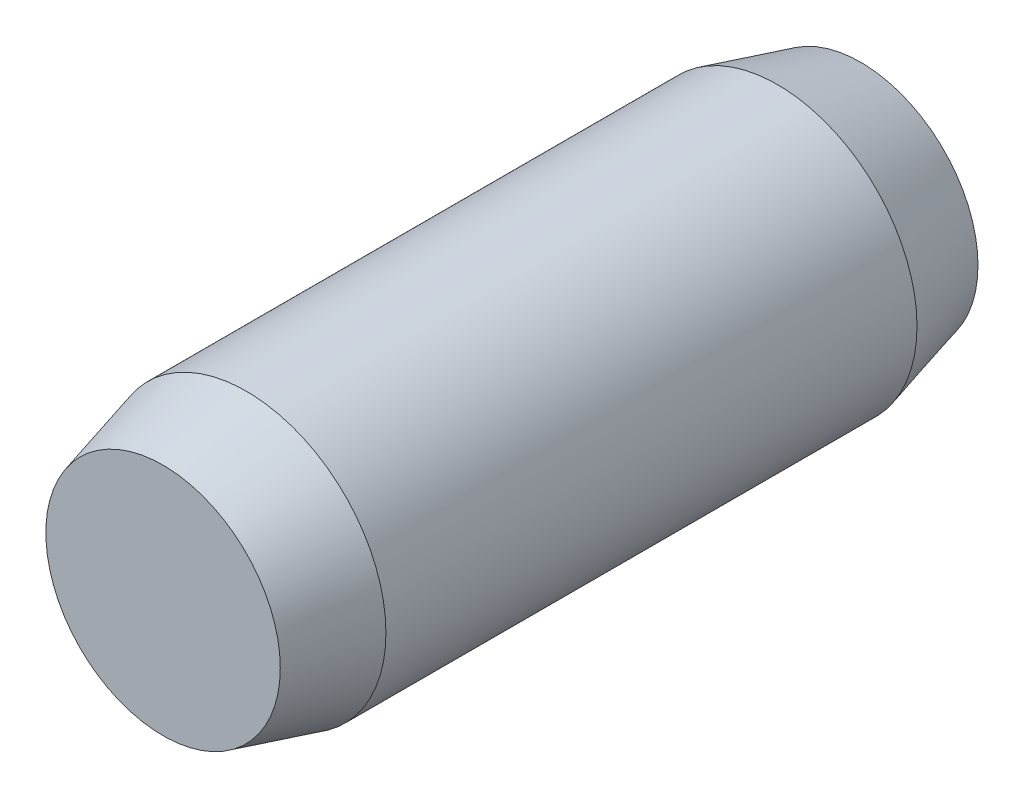
ISO-10303-21;
HEADER;
FILE_DESCRIPTION(('STEP AP214'),'2;1');
FILE_NAME('part.step','',(''),(''),'','','');
FILE_SCHEMA(('AUTOMOTIVE_DESIGN { 1 0 10303 214 1 1 1 1 }'));
ENDSEC;
DATA;
#1=APPLICATION_CONTEXT('core data for automotive mechanical design processes');
#2=APPLICATION_PROTOCOL_DEFINITION('international standard','automotive_design',2000,#1);
#3=PRODUCT_CONTEXT('',#1,'mechanical');
#4=PRODUCT('Part','Part','',(#3));
#5=PRODUCT_RELATED_PRODUCT_CATEGORY('part','',(#4));
#6=PRODUCT_DEFINITION_FORMATION('','',#4);
#7=PRODUCT_DEFINITION_CONTEXT('part definition',#1,'design');
#8=PRODUCT_DEFINITION('design','',#6,#7);
#9=PRODUCT_DEFINITION_SHAPE('','',#8);
#10=(LENGTH_UNIT() NAMED_UNIT(*) SI_UNIT(.MILLI.,.METRE.));
#11=(NAMED_UNIT(*) PLANE_ANGLE_UNIT() SI_UNIT($,.RADIAN.));
#12=(NAMED_UNIT(*) SI_UNIT($,.STERADIAN.) SOLID_ANGLE_UNIT());
#13=UNCERTAINTY_MEASURE_WITH_UNIT(LENGTH_MEASURE(1.E-05),#10,'distance_accuracy_value','');
#14=(GEOMETRIC_REPRESENTATION_CONTEXT(3) GLOBAL_UNCERTAINTY_ASSIGNED_CONTEXT((#13)) GLOBAL_UNIT_ASSIGNED_CONTEXT((#10,
#11,#12)) REPRESENTATION_CONTEXT('',''));
#15=CARTESIAN_POINT('',(0.,0.,0.));
#16=DIRECTION('',(0.,0.,1.));
#17=DIRECTION('',(1.,0.,0.));
#18=AXIS2_PLACEMENT_3D('',#15,#16,#17);
#19=CARTESIAN_POINT('',(0.,0.,3.02080909487751));
#20=DIRECTION('',(0.,0.,-1.));
#21=DIRECTION('',(-1.,0.,0.));
#22=AXIS2_PLACEMENT_3D('',#19,#20,#21);
#23=CONICAL_SURFACE('',#22,1.5875,0.26179938779915);
#24=CARTESIAN_POINT('',(0.,0.,3.96875));
#25=DIRECTION('',(0.,0.,1.));
#26=DIRECTION('',(1.,0.,0.));
#27=AXIS2_PLACEMENT_3D('',#24,#25,#26);
#28=CIRCLE('',#27,1.3335);
#29=CARTESIAN_POINT('',(1.3335,0.,3.96875));
#30=VERTEX_POINT('',#29);
#31=EDGE_CURVE('E44',#30,#30,#28,.T.);
#32=ORIENTED_EDGE('',*,*,#31,.F.);
#33=EDGE_LOOP('',(#32));
#34=FACE_BOUND('',#33,.T.);
#35=CARTESIAN_POINT('',(0.,0.,3.02080909487751));
#36=DIRECTION('',(0.,0.,1.));
#37=DIRECTION('',(1.,0.,0.));
#38=AXIS2_PLACEMENT_3D('',#35,#36,#37);
#39=CIRCLE('',#38,1.5875);
#40=CARTESIAN_POINT('',(1.5875,0.,3.02080909487751));
#41=VERTEX_POINT('',#40);
#42=EDGE_CURVE('E10',#41,#41,#39,.T.);
#43=ORIENTED_EDGE('',*,*,#42,.T.);
#44=EDGE_LOOP('',(#43));
#45=FACE_BOUND('',#44,.T.);
#46=ADVANCED_FACE('F30',(#34,#45),#23,.T.);
#47=CARTESIAN_POINT('',(0.,0.,3.96875));
#48=DIRECTION('',(0.,0.,1.));
#49=DIRECTION('',(1.,0.,0.));
#50=AXIS2_PLACEMENT_3D('',#47,#48,#49);
#51=CYLINDRICAL_SURFACE('',#50,1.5875);
#52=ORIENTED_EDGE('',*,*,#42,.F.);
#53=EDGE_LOOP('',(#52));
#54=FACE_BOUND('',#53,.T.);
#55=CARTESIAN_POINT('',(0.,0.,-3.02080909487751));
#56=DIRECTION('',(0.,0.,1.));
#57=DIRECTION('',(1.,0.,0.));
#58=AXIS2_PLACEMENT_3D('',#55,#56,#57);
#59=CIRCLE('',#58,1.5875);
#60=CARTESIAN_POINT('',(1.5875,0.,-3.02080909487751));
#61=VERTEX_POINT('',#60);
#62=EDGE_CURVE('E36',#61,#61,#59,.T.);
#63=ORIENTED_EDGE('',*,*,#62,.T.);
#64=EDGE_LOOP('',(#63));
#65=FACE_BOUND('',#64,.T.);
#66=ADVANCED_FACE('F53',(#54,#65),#51,.T.);
#67=CARTESIAN_POINT('',(0.,0.,-3.96875));
#68=DIRECTION('',(0.,0.,1.));
#69=DIRECTION('',(1.,0.,0.));
#70=AXIS2_PLACEMENT_3D('',#67,#68,#69);
#71=CONICAL_SURFACE('',#70,1.3335,0.26179938779915);
#72=ORIENTED_EDGE('',*,*,#62,.F.);
#73=EDGE_LOOP('',(#72));
#74=FACE_BOUND('',#73,.T.);
#75=CARTESIAN_POINT('',(0.,0.,-3.96875));
#76=DIRECTION('',(0.,0.,1.));
#77=DIRECTION('',(1.,0.,0.));
#78=AXIS2_PLACEMENT_3D('',#75,#76,#77);
#79=CIRCLE('',#78,1.3335);
#80=CARTESIAN_POINT('',(1.3335,0.,-3.96875));
#81=VERTEX_POINT('',#80);
#82=EDGE_CURVE('E40',#81,#81,#79,.T.);
#83=ORIENTED_EDGE('',*,*,#82,.T.);
#84=EDGE_LOOP('',(#83));
#85=FACE_BOUND('',#84,.T.);
#86=ADVANCED_FACE('F57',(#74,#85),#71,.T.);
#87=CARTESIAN_POINT('',(0.,1.3335,-3.96875));
#88=DIRECTION('',(0.,0.,1.));
#89=DIRECTION('',(1.,0.,0.));
#90=AXIS2_PLACEMENT_3D('',#87,#88,#89);
#91=PLANE('',#90);
#92=ORIENTED_EDGE('',*,*,#82,.F.);
#93=EDGE_LOOP('',(#92));
#94=FACE_BOUND('',#93,.T.);
#95=ADVANCED_FACE('F62',(#94),#91,.F.);
#96=CARTESIAN_POINT('',(0.,0.,3.96875));
#97=DIRECTION('',(0.,0.,-1.));
#98=DIRECTION('',(-1.,0.,0.));
#99=AXIS2_PLACEMENT_3D('',#96,#97,#98);
#100=PLANE('',#99);
#101=ORIENTED_EDGE('',*,*,#31,.T.);
#102=EDGE_LOOP('',(#101));
#103=FACE_BOUND('',#102,.T.);
#104=ADVANCED_FACE('F50',(#103),#100,.F.);
#105=CLOSED_SHELL('',(#46,#66,#86,#95,#104));
#106=MANIFOLD_SOLID_BREP('B2',#105);
#107=ADVANCED_BREP_SHAPE_REPRESENTATION('',(#18,#106),#14);
#108=SHAPE_DEFINITION_REPRESENTATION(#9,#107);
ENDSEC;
END-ISO-10303-21;
